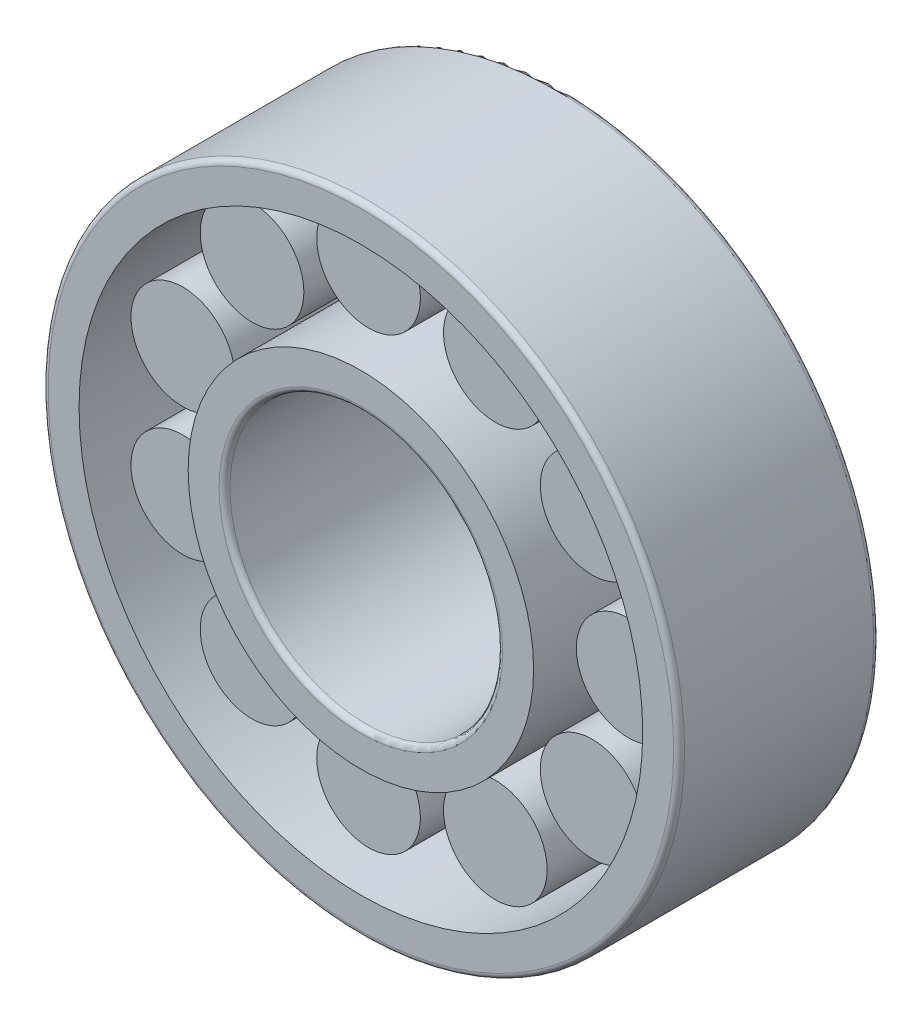
ISO-10303-21;
HEADER;
FILE_DESCRIPTION(('STEP AP214'),'2;1');
FILE_NAME('part.step','',(''),(''),'','','');
FILE_SCHEMA(('AUTOMOTIVE_DESIGN { 1 0 10303 214 1 1 1 1 }'));
ENDSEC;
DATA;
#1=APPLICATION_CONTEXT('core data for automotive mechanical design processes');
#2=APPLICATION_PROTOCOL_DEFINITION('international standard','automotive_design',2000,#1);
#3=PRODUCT_CONTEXT('',#1,'mechanical');
#4=PRODUCT('Part','Part','',(#3));
#5=PRODUCT_RELATED_PRODUCT_CATEGORY('part','',(#4));
#6=PRODUCT_DEFINITION_FORMATION('','',#4);
#7=PRODUCT_DEFINITION_CONTEXT('part definition',#1,'design');
#8=PRODUCT_DEFINITION('design','',#6,#7);
#9=PRODUCT_DEFINITION_SHAPE('','',#8);
#10=(LENGTH_UNIT() NAMED_UNIT(*) SI_UNIT(.MILLI.,.METRE.));
#11=(NAMED_UNIT(*) PLANE_ANGLE_UNIT() SI_UNIT($,.RADIAN.));
#12=(NAMED_UNIT(*) SI_UNIT($,.STERADIAN.) SOLID_ANGLE_UNIT());
#13=UNCERTAINTY_MEASURE_WITH_UNIT(LENGTH_MEASURE(1.E-05),#10,'distance_accuracy_value','');
#14=(GEOMETRIC_REPRESENTATION_CONTEXT(3) GLOBAL_UNCERTAINTY_ASSIGNED_CONTEXT((#13)) GLOBAL_UNIT_ASSIGNED_CONTEXT((#10,
#11,#12)) REPRESENTATION_CONTEXT('',''));
#15=CARTESIAN_POINT('',(0.,0.,0.));
#16=DIRECTION('',(0.,0.,1.));
#17=DIRECTION('',(1.,0.,0.));
#18=AXIS2_PLACEMENT_3D('',#15,#16,#17);
#19=CARTESIAN_POINT('',(10.5156691603898,-6.75801021819497,3.3));
#20=DIRECTION('',(0.,0.,-1.));
#21=DIRECTION('',(-0.841253532831181,0.540640817455598,0.));
#22=AXIS2_PLACEMENT_3D('',#19,#20,#21);
#23=PLANE('',#22);
#24=CARTESIAN_POINT('',(10.5156691603898,-6.75801021819497,3.3));
#25=DIRECTION('',(0.,0.,-1.));
#26=DIRECTION('',(-0.841253532831181,0.540640817455598,0.));
#27=AXIS2_PLACEMENT_3D('',#24,#25,#26);
#28=CIRCLE('',#27,2.85);
#29=CARTESIAN_POINT('',(8.1180965918209,-5.21718388844652,3.3));
#30=VERTEX_POINT('',#29);
#31=EDGE_CURVE('E11',#30,#30,#28,.T.);
#32=ORIENTED_EDGE('',*,*,#31,.F.);
#33=EDGE_LOOP('',(#32));
#34=FACE_BOUND('',#33,.T.);
#35=ADVANCED_FACE('F42',(#34),#23,.F.);
#36=CARTESIAN_POINT('',(10.5156691603898,-6.75801021819497,-3.3));
#37=DIRECTION('',(0.,0.,-1.));
#38=DIRECTION('',(-0.841253532831181,0.540640817455598,0.));
#39=AXIS2_PLACEMENT_3D('',#36,#37,#38);
#40=CYLINDRICAL_SURFACE('',#39,2.85);
#41=CARTESIAN_POINT('',(10.5156691603898,-6.75801021819497,-3.3));
#42=DIRECTION('',(0.,0.,-1.));
#43=DIRECTION('',(-0.841253532831181,0.540640817455598,0.));
#44=AXIS2_PLACEMENT_3D('',#41,#42,#43);
#45=CIRCLE('',#44,2.85);
#46=CARTESIAN_POINT('',(8.1180965918209,-5.21718388844652,-3.3));
#47=VERTEX_POINT('',#46);
#48=EDGE_CURVE('E48',#47,#47,#45,.T.);
#49=ORIENTED_EDGE('',*,*,#48,.F.);
#50=EDGE_LOOP('',(#49));
#51=FACE_BOUND('',#50,.T.);
#52=ORIENTED_EDGE('',*,*,#31,.T.);
#53=EDGE_LOOP('',(#52));
#54=FACE_BOUND('',#53,.T.);
#55=ADVANCED_FACE('F56',(#51,#54),#40,.T.);
#56=CARTESIAN_POINT('',(12.9132417289586,-8.29883654794342,-3.3));
#57=DIRECTION('',(0.,0.,1.));
#58=DIRECTION('',(0.841253532831181,-0.540640817455598,0.));
#59=AXIS2_PLACEMENT_3D('',#56,#57,#58);
#60=PLANE('',#59);
#61=ORIENTED_EDGE('',*,*,#48,.T.);
#62=EDGE_LOOP('',(#61));
#63=FACE_BOUND('',#62,.T.);
#64=ADVANCED_FACE('F54',(#63),#60,.F.);
#65=CLOSED_SHELL('',(#35,#55,#64));
#66=MANIFOLD_SOLID_BREP('B2',#65);
#67=CARTESIAN_POINT('',(5.19268766252358,-11.3703999419315,3.3));
#68=DIRECTION('',(0.,0.,-1.));
#69=DIRECTION('',(-0.415415013001886,0.909631995354519,0.));
#70=AXIS2_PLACEMENT_3D('',#67,#68,#69);
#71=PLANE('',#70);
#72=CARTESIAN_POINT('',(5.19268766252358,-11.3703999419315,3.3));
#73=DIRECTION('',(0.,0.,-1.));
#74=DIRECTION('',(-0.415415013001886,0.909631995354519,0.));
#75=AXIS2_PLACEMENT_3D('',#72,#73,#74);
#76=CIRCLE('',#75,2.85);
#77=CARTESIAN_POINT('',(4.0087548754682,-8.7779487551711,3.3));
#78=VERTEX_POINT('',#77);
#79=EDGE_CURVE('E41',#78,#78,#76,.T.);
#80=ORIENTED_EDGE('',*,*,#79,.F.);
#81=EDGE_LOOP('',(#80));
#82=FACE_BOUND('',#81,.T.);
#83=ADVANCED_FACE('F91',(#82),#71,.F.);
#84=CARTESIAN_POINT('',(5.19268766252358,-11.3703999419315,-3.3));
#85=DIRECTION('',(0.,0.,-1.));
#86=DIRECTION('',(-0.415415013001886,0.909631995354519,0.));
#87=AXIS2_PLACEMENT_3D('',#84,#85,#86);
#88=CYLINDRICAL_SURFACE('',#87,2.85);
#89=CARTESIAN_POINT('',(5.19268766252358,-11.3703999419315,-3.3));
#90=DIRECTION('',(0.,0.,-1.));
#91=DIRECTION('',(-0.415415013001886,0.909631995354519,0.));
#92=AXIS2_PLACEMENT_3D('',#89,#90,#91);
#93=CIRCLE('',#92,2.85);
#94=CARTESIAN_POINT('',(4.0087548754682,-8.7779487551711,-3.3));
#95=VERTEX_POINT('',#94);
#96=EDGE_CURVE('E97',#95,#95,#93,.T.);
#97=ORIENTED_EDGE('',*,*,#96,.F.);
#98=EDGE_LOOP('',(#97));
#99=FACE_BOUND('',#98,.T.);
#100=ORIENTED_EDGE('',*,*,#79,.T.);
#101=EDGE_LOOP('',(#100));
#102=FACE_BOUND('',#101,.T.);
#103=ADVANCED_FACE('F105',(#99,#102),#88,.T.);
#104=CARTESIAN_POINT('',(6.37662044957895,-13.9628511286919,-3.3));
#105=DIRECTION('',(0.,0.,1.));
#106=DIRECTION('',(0.415415013001886,-0.909631995354519,0.));
#107=AXIS2_PLACEMENT_3D('',#104,#105,#106);
#108=PLANE('',#107);
#109=ORIENTED_EDGE('',*,*,#96,.T.);
#110=EDGE_LOOP('',(#109));
#111=FACE_BOUND('',#110,.T.);
#112=ADVANCED_FACE('F103',(#111),#108,.F.);
#113=CLOSED_SHELL('',(#83,#103,#112));
#114=MANIFOLD_SOLID_BREP('B6',#113);
#115=CARTESIAN_POINT('',(-1.77893547841607,-12.3727680235117,3.3));
#116=DIRECTION('',(0.,0.,-1.));
#117=DIRECTION('',(0.142314838273285,0.989821441880933,0.));
#118=AXIS2_PLACEMENT_3D('',#115,#116,#117);
#119=PLANE('',#118);
#120=CARTESIAN_POINT('',(-1.77893547841607,-12.3727680235117,3.3));
#121=DIRECTION('',(0.,0.,-1.));
#122=DIRECTION('',(0.142314838273285,0.989821441880933,0.));
#123=AXIS2_PLACEMENT_3D('',#120,#121,#122);
#124=CIRCLE('',#123,2.85);
#125=CARTESIAN_POINT('',(-1.3733381893372,-9.551776914151,3.3));
#126=VERTEX_POINT('',#125);
#127=EDGE_CURVE('E90',#126,#126,#124,.T.);
#128=ORIENTED_EDGE('',*,*,#127,.F.);
#129=EDGE_LOOP('',(#128));
#130=FACE_BOUND('',#129,.T.);
#131=ADVANCED_FACE('F140',(#130),#119,.F.);
#132=CARTESIAN_POINT('',(-1.77893547841607,-12.3727680235117,-3.3));
#133=DIRECTION('',(0.,0.,-1.));
#134=DIRECTION('',(0.142314838273285,0.989821441880933,0.));
#135=AXIS2_PLACEMENT_3D('',#132,#133,#134);
#136=CYLINDRICAL_SURFACE('',#135,2.85);
#137=CARTESIAN_POINT('',(-1.77893547841607,-12.3727680235117,-3.3));
#138=DIRECTION('',(0.,0.,-1.));
#139=DIRECTION('',(0.142314838273285,0.989821441880933,0.));
#140=AXIS2_PLACEMENT_3D('',#137,#138,#139);
#141=CIRCLE('',#140,2.85);
#142=CARTESIAN_POINT('',(-1.3733381893372,-9.551776914151,-3.3));
#143=VERTEX_POINT('',#142);
#144=EDGE_CURVE('E146',#143,#143,#141,.T.);
#145=ORIENTED_EDGE('',*,*,#144,.F.);
#146=EDGE_LOOP('',(#145));
#147=FACE_BOUND('',#146,.T.);
#148=ORIENTED_EDGE('',*,*,#127,.T.);
#149=EDGE_LOOP('',(#148));
#150=FACE_BOUND('',#149,.T.);
#151=ADVANCED_FACE('F154',(#147,#150),#136,.T.);
#152=CARTESIAN_POINT('',(-2.18453276749493,-15.1937591328723,-3.3));
#153=DIRECTION('',(0.,0.,1.));
#154=DIRECTION('',(-0.142314838273285,-0.989821441880933,0.));
#155=AXIS2_PLACEMENT_3D('',#152,#153,#154);
#156=PLANE('',#155);
#157=ORIENTED_EDGE('',*,*,#144,.T.);
#158=EDGE_LOOP('',(#157));
#159=FACE_BOUND('',#158,.T.);
#160=ADVANCED_FACE('F152',(#159),#156,.F.);
#161=CLOSED_SHELL('',(#131,#151,#160));
#162=MANIFOLD_SOLID_BREP('B36',#161);
#163=CARTESIAN_POINT('',(-8.18575917431607,-9.44686967942823,3.3));
#164=DIRECTION('',(0.,0.,-1.));
#165=DIRECTION('',(0.654860733945285,0.755749574354258,0.));
#166=AXIS2_PLACEMENT_3D('',#163,#164,#165);
#167=PLANE('',#166);
#168=CARTESIAN_POINT('',(-8.18575917431607,-9.44686967942823,3.3));
#169=DIRECTION('',(0.,0.,-1.));
#170=DIRECTION('',(0.654860733945285,0.755749574354258,0.));
#171=AXIS2_PLACEMENT_3D('',#168,#169,#170);
#172=CIRCLE('',#171,2.85);
#173=CARTESIAN_POINT('',(-6.319406082572,-7.29298339251859,3.3));
#174=VERTEX_POINT('',#173);
#175=EDGE_CURVE('E139',#174,#174,#172,.T.);
#176=ORIENTED_EDGE('',*,*,#175,.F.);
#177=EDGE_LOOP('',(#176));
#178=FACE_BOUND('',#177,.T.);
#179=ADVANCED_FACE('F189',(#178),#167,.F.);
#180=CARTESIAN_POINT('',(-8.18575917431607,-9.44686967942823,-3.3));
#181=DIRECTION('',(0.,0.,-1.));
#182=DIRECTION('',(0.654860733945285,0.755749574354258,0.));
#183=AXIS2_PLACEMENT_3D('',#180,#181,#182);
#184=CYLINDRICAL_SURFACE('',#183,2.85);
#185=CARTESIAN_POINT('',(-8.18575917431607,-9.44686967942823,-3.3));
#186=DIRECTION('',(0.,0.,-1.));
#187=DIRECTION('',(0.654860733945285,0.755749574354258,0.));
#188=AXIS2_PLACEMENT_3D('',#185,#186,#187);
#189=CIRCLE('',#188,2.85);
#190=CARTESIAN_POINT('',(-6.319406082572,-7.29298339251859,-3.3));
#191=VERTEX_POINT('',#190);
#192=EDGE_CURVE('E195',#191,#191,#189,.T.);
#193=ORIENTED_EDGE('',*,*,#192,.F.);
#194=EDGE_LOOP('',(#193));
#195=FACE_BOUND('',#194,.T.);
#196=ORIENTED_EDGE('',*,*,#175,.T.);
#197=EDGE_LOOP('',(#196));
#198=FACE_BOUND('',#197,.T.);
#199=ADVANCED_FACE('F203',(#195,#198),#184,.T.);
#200=CARTESIAN_POINT('',(-10.0521122660601,-11.6007559663379,-3.3));
#201=DIRECTION('',(0.,0.,1.));
#202=DIRECTION('',(-0.654860733945285,-0.755749574354258,0.));
#203=AXIS2_PLACEMENT_3D('',#200,#201,#202);
#204=PLANE('',#203);
#205=ORIENTED_EDGE('',*,*,#192,.T.);
#206=EDGE_LOOP('',(#205));
#207=FACE_BOUND('',#206,.T.);
#208=ADVANCED_FACE('F201',(#207),#204,.F.);
#209=CLOSED_SHELL('',(#179,#199,#208));
#210=MANIFOLD_SOLID_BREP('B85',#209);
#211=CARTESIAN_POINT('',(-11.9936621701812,-3.52165696051787,3.3));
#212=DIRECTION('',(0.,0.,-1.));
#213=DIRECTION('',(0.959492973614497,0.281732556841429,0.));
#214=AXIS2_PLACEMENT_3D('',#211,#212,#213);
#215=PLANE('',#214);
#216=CARTESIAN_POINT('',(-11.9936621701812,-3.52165696051787,3.3));
#217=DIRECTION('',(0.,0.,-1.));
#218=DIRECTION('',(0.959492973614497,0.281732556841429,0.));
#219=AXIS2_PLACEMENT_3D('',#216,#217,#218);
#220=CIRCLE('',#219,2.85);
#221=CARTESIAN_POINT('',(-9.2591071953799,-2.71871917351979,3.3));
#222=VERTEX_POINT('',#221);
#223=EDGE_CURVE('E188',#222,#222,#220,.T.);
#224=ORIENTED_EDGE('',*,*,#223,.F.);
#225=EDGE_LOOP('',(#224));
#226=FACE_BOUND('',#225,.T.);
#227=ADVANCED_FACE('F238',(#226),#215,.F.);
#228=CARTESIAN_POINT('',(-11.9936621701812,-3.52165696051787,-3.3));
#229=DIRECTION('',(0.,0.,-1.));
#230=DIRECTION('',(0.959492973614497,0.281732556841429,0.));
#231=AXIS2_PLACEMENT_3D('',#228,#229,#230);
#232=CYLINDRICAL_SURFACE('',#231,2.85);
#233=CARTESIAN_POINT('',(-11.9936621701812,-3.52165696051787,-3.3));
#234=DIRECTION('',(0.,0.,-1.));
#235=DIRECTION('',(0.959492973614497,0.281732556841429,0.));
#236=AXIS2_PLACEMENT_3D('',#233,#234,#235);
#237=CIRCLE('',#236,2.85);
#238=CARTESIAN_POINT('',(-9.2591071953799,-2.71871917351979,-3.3));
#239=VERTEX_POINT('',#238);
#240=EDGE_CURVE('E244',#239,#239,#237,.T.);
#241=ORIENTED_EDGE('',*,*,#240,.F.);
#242=EDGE_LOOP('',(#241));
#243=FACE_BOUND('',#242,.T.);
#244=ORIENTED_EDGE('',*,*,#223,.T.);
#245=EDGE_LOOP('',(#244));
#246=FACE_BOUND('',#245,.T.);
#247=ADVANCED_FACE('F252',(#243,#246),#232,.T.);
#248=CARTESIAN_POINT('',(-14.7282171449825,-4.32459474751594,-3.3));
#249=DIRECTION('',(0.,0.,1.));
#250=DIRECTION('',(-0.959492973614497,-0.281732556841429,0.));
#251=AXIS2_PLACEMENT_3D('',#248,#249,#250);
#252=PLANE('',#251);
#253=ORIENTED_EDGE('',*,*,#240,.T.);
#254=EDGE_LOOP('',(#253));
#255=FACE_BOUND('',#254,.T.);
#256=ADVANCED_FACE('F250',(#255),#252,.F.);
#257=CLOSED_SHELL('',(#227,#247,#256));
#258=MANIFOLD_SOLID_BREP('B134',#257);
#259=CARTESIAN_POINT('',(-11.9936621701812,3.52165696051787,3.3));
#260=DIRECTION('',(0.,0.,-1.));
#261=DIRECTION('',(0.959492973614498,-0.28173255684143,0.));
#262=AXIS2_PLACEMENT_3D('',#259,#260,#261);
#263=PLANE('',#262);
#264=CARTESIAN_POINT('',(-11.9936621701812,3.52165696051787,3.3));
#265=DIRECTION('',(0.,0.,-1.));
#266=DIRECTION('',(0.959492973614498,-0.28173255684143,0.));
#267=AXIS2_PLACEMENT_3D('',#264,#265,#266);
#268=CIRCLE('',#267,2.85);
#269=CARTESIAN_POINT('',(-9.2591071953799,2.7187191735198,3.3));
#270=VERTEX_POINT('',#269);
#271=EDGE_CURVE('E237',#270,#270,#268,.T.);
#272=ORIENTED_EDGE('',*,*,#271,.F.);
#273=EDGE_LOOP('',(#272));
#274=FACE_BOUND('',#273,.T.);
#275=ADVANCED_FACE('F287',(#274),#263,.F.);
#276=CARTESIAN_POINT('',(-11.9936621701812,3.52165696051787,-3.3));
#277=DIRECTION('',(0.,0.,-1.));
#278=DIRECTION('',(0.959492973614498,-0.28173255684143,0.));
#279=AXIS2_PLACEMENT_3D('',#276,#277,#278);
#280=CYLINDRICAL_SURFACE('',#279,2.85);
#281=CARTESIAN_POINT('',(-11.9936621701812,3.52165696051787,-3.3));
#282=DIRECTION('',(0.,0.,-1.));
#283=DIRECTION('',(0.959492973614498,-0.28173255684143,0.));
#284=AXIS2_PLACEMENT_3D('',#281,#282,#283);
#285=CIRCLE('',#284,2.85);
#286=CARTESIAN_POINT('',(-9.2591071953799,2.7187191735198,-3.3));
#287=VERTEX_POINT('',#286);
#288=EDGE_CURVE('E293',#287,#287,#285,.T.);
#289=ORIENTED_EDGE('',*,*,#288,.F.);
#290=EDGE_LOOP('',(#289));
#291=FACE_BOUND('',#290,.T.);
#292=ORIENTED_EDGE('',*,*,#271,.T.);
#293=EDGE_LOOP('',(#292));
#294=FACE_BOUND('',#293,.T.);
#295=ADVANCED_FACE('F301',(#291,#294),#280,.T.);
#296=CARTESIAN_POINT('',(-14.7282171449825,4.32459474751595,-3.3));
#297=DIRECTION('',(0.,0.,1.));
#298=DIRECTION('',(-0.959492973614498,0.28173255684143,0.));
#299=AXIS2_PLACEMENT_3D('',#296,#297,#298);
#300=PLANE('',#299);
#301=ORIENTED_EDGE('',*,*,#288,.T.);
#302=EDGE_LOOP('',(#301));
#303=FACE_BOUND('',#302,.T.);
#304=ADVANCED_FACE('F299',(#303),#300,.F.);
#305=CLOSED_SHELL('',(#275,#295,#304));
#306=MANIFOLD_SOLID_BREP('B183',#305);
#307=CARTESIAN_POINT('',(-8.18575917431606,9.44686967942823,3.3));
#308=DIRECTION('',(0.,0.,-1.));
#309=DIRECTION('',(0.654860733945285,-0.755749574354258,0.));
#310=AXIS2_PLACEMENT_3D('',#307,#308,#309);
#311=PLANE('',#310);
#312=CARTESIAN_POINT('',(-8.18575917431606,9.44686967942823,3.3));
#313=DIRECTION('',(0.,0.,-1.));
#314=DIRECTION('',(0.654860733945285,-0.755749574354258,0.));
#315=AXIS2_PLACEMENT_3D('',#312,#313,#314);
#316=CIRCLE('',#315,2.85);
#317=CARTESIAN_POINT('',(-6.319406082572,7.29298339251859,3.3));
#318=VERTEX_POINT('',#317);
#319=EDGE_CURVE('E286',#318,#318,#316,.T.);
#320=ORIENTED_EDGE('',*,*,#319,.F.);
#321=EDGE_LOOP('',(#320));
#322=FACE_BOUND('',#321,.T.);
#323=ADVANCED_FACE('F336',(#322),#311,.F.);
#324=CARTESIAN_POINT('',(-8.18575917431606,9.44686967942823,-3.3));
#325=DIRECTION('',(0.,0.,-1.));
#326=DIRECTION('',(0.654860733945285,-0.755749574354258,0.));
#327=AXIS2_PLACEMENT_3D('',#324,#325,#326);
#328=CYLINDRICAL_SURFACE('',#327,2.85);
#329=CARTESIAN_POINT('',(-8.18575917431606,9.44686967942823,-3.3));
#330=DIRECTION('',(0.,0.,-1.));
#331=DIRECTION('',(0.654860733945285,-0.755749574354258,0.));
#332=AXIS2_PLACEMENT_3D('',#329,#330,#331);
#333=CIRCLE('',#332,2.85);
#334=CARTESIAN_POINT('',(-6.319406082572,7.29298339251859,-3.3));
#335=VERTEX_POINT('',#334);
#336=EDGE_CURVE('E342',#335,#335,#333,.T.);
#337=ORIENTED_EDGE('',*,*,#336,.F.);
#338=EDGE_LOOP('',(#337));
#339=FACE_BOUND('',#338,.T.);
#340=ORIENTED_EDGE('',*,*,#319,.T.);
#341=EDGE_LOOP('',(#340));
#342=FACE_BOUND('',#341,.T.);
#343=ADVANCED_FACE('F350',(#339,#342),#328,.T.);
#344=CARTESIAN_POINT('',(-10.0521122660601,11.6007559663379,-3.3));
#345=DIRECTION('',(0.,0.,1.));
#346=DIRECTION('',(-0.654860733945285,0.755749574354258,0.));
#347=AXIS2_PLACEMENT_3D('',#344,#345,#346);
#348=PLANE('',#347);
#349=ORIENTED_EDGE('',*,*,#336,.T.);
#350=EDGE_LOOP('',(#349));
#351=FACE_BOUND('',#350,.T.);
#352=ADVANCED_FACE('F348',(#351),#348,.F.);
#353=CLOSED_SHELL('',(#323,#343,#352));
#354=MANIFOLD_SOLID_BREP('B232',#353);
#355=CARTESIAN_POINT('',(-1.77893547841606,12.3727680235117,3.3));
#356=DIRECTION('',(0.,0.,-1.));
#357=DIRECTION('',(0.142314838273285,-0.989821441880933,0.));
#358=AXIS2_PLACEMENT_3D('',#355,#356,#357);
#359=PLANE('',#358);
#360=CARTESIAN_POINT('',(-1.77893547841606,12.3727680235117,3.3));
#361=DIRECTION('',(0.,0.,-1.));
#362=DIRECTION('',(0.142314838273285,-0.989821441880933,0.));
#363=AXIS2_PLACEMENT_3D('',#360,#361,#362);
#364=CIRCLE('',#363,2.85);
#365=CARTESIAN_POINT('',(-1.3733381893372,9.551776914151,3.3));
#366=VERTEX_POINT('',#365);
#367=EDGE_CURVE('E335',#366,#366,#364,.T.);
#368=ORIENTED_EDGE('',*,*,#367,.F.);
#369=EDGE_LOOP('',(#368));
#370=FACE_BOUND('',#369,.T.);
#371=ADVANCED_FACE('F385',(#370),#359,.F.);
#372=CARTESIAN_POINT('',(-1.77893547841606,12.3727680235117,-3.3));
#373=DIRECTION('',(0.,0.,-1.));
#374=DIRECTION('',(0.142314838273285,-0.989821441880933,0.));
#375=AXIS2_PLACEMENT_3D('',#372,#373,#374);
#376=CYLINDRICAL_SURFACE('',#375,2.85);
#377=CARTESIAN_POINT('',(-1.77893547841606,12.3727680235117,-3.3));
#378=DIRECTION('',(0.,0.,-1.));
#379=DIRECTION('',(0.142314838273285,-0.989821441880933,0.));
#380=AXIS2_PLACEMENT_3D('',#377,#378,#379);
#381=CIRCLE('',#380,2.85);
#382=CARTESIAN_POINT('',(-1.3733381893372,9.551776914151,-3.3));
#383=VERTEX_POINT('',#382);
#384=EDGE_CURVE('E391',#383,#383,#381,.T.);
#385=ORIENTED_EDGE('',*,*,#384,.F.);
#386=EDGE_LOOP('',(#385));
#387=FACE_BOUND('',#386,.T.);
#388=ORIENTED_EDGE('',*,*,#367,.T.);
#389=EDGE_LOOP('',(#388));
#390=FACE_BOUND('',#389,.T.);
#391=ADVANCED_FACE('F399',(#387,#390),#376,.T.);
#392=CARTESIAN_POINT('',(-2.18453276749493,15.1937591328723,-3.3));
#393=DIRECTION('',(0.,0.,1.));
#394=DIRECTION('',(-0.142314838273285,0.989821441880933,0.));
#395=AXIS2_PLACEMENT_3D('',#392,#393,#394);
#396=PLANE('',#395);
#397=ORIENTED_EDGE('',*,*,#384,.T.);
#398=EDGE_LOOP('',(#397));
#399=FACE_BOUND('',#398,.T.);
#400=ADVANCED_FACE('F397',(#399),#396,.F.);
#401=CLOSED_SHELL('',(#371,#391,#400));
#402=MANIFOLD_SOLID_BREP('B281',#401);
#403=CARTESIAN_POINT('',(5.19268766252358,11.3703999419315,3.3));
#404=DIRECTION('',(0.,0.,-1.));
#405=DIRECTION('',(-0.415415013001886,-0.909631995354518,0.));
#406=AXIS2_PLACEMENT_3D('',#403,#404,#405);
#407=PLANE('',#406);
#408=CARTESIAN_POINT('',(5.19268766252358,11.3703999419315,3.3));
#409=DIRECTION('',(0.,0.,-1.));
#410=DIRECTION('',(-0.415415013001886,-0.909631995354518,0.));
#411=AXIS2_PLACEMENT_3D('',#408,#409,#410);
#412=CIRCLE('',#411,2.85);
#413=CARTESIAN_POINT('',(4.0087548754682,8.7779487551711,3.3));
#414=VERTEX_POINT('',#413);
#415=EDGE_CURVE('E384',#414,#414,#412,.T.);
#416=ORIENTED_EDGE('',*,*,#415,.F.);
#417=EDGE_LOOP('',(#416));
#418=FACE_BOUND('',#417,.T.);
#419=ADVANCED_FACE('F434',(#418),#407,.F.);
#420=CARTESIAN_POINT('',(5.19268766252358,11.3703999419315,-3.3));
#421=DIRECTION('',(0.,0.,-1.));
#422=DIRECTION('',(-0.415415013001886,-0.909631995354518,0.));
#423=AXIS2_PLACEMENT_3D('',#420,#421,#422);
#424=CYLINDRICAL_SURFACE('',#423,2.85);
#425=CARTESIAN_POINT('',(5.19268766252358,11.3703999419315,-3.3));
#426=DIRECTION('',(0.,0.,-1.));
#427=DIRECTION('',(-0.415415013001886,-0.909631995354518,0.));
#428=AXIS2_PLACEMENT_3D('',#425,#426,#427);
#429=CIRCLE('',#428,2.85);
#430=CARTESIAN_POINT('',(4.0087548754682,8.7779487551711,-3.3));
#431=VERTEX_POINT('',#430);
#432=EDGE_CURVE('E440',#431,#431,#429,.T.);
#433=ORIENTED_EDGE('',*,*,#432,.F.);
#434=EDGE_LOOP('',(#433));
#435=FACE_BOUND('',#434,.T.);
#436=ORIENTED_EDGE('',*,*,#415,.T.);
#437=EDGE_LOOP('',(#436));
#438=FACE_BOUND('',#437,.T.);
#439=ADVANCED_FACE('F448',(#435,#438),#424,.T.);
#440=CARTESIAN_POINT('',(6.37662044957896,13.9628511286919,-3.3));
#441=DIRECTION('',(0.,0.,1.));
#442=DIRECTION('',(0.415415013001886,0.909631995354518,0.));
#443=AXIS2_PLACEMENT_3D('',#440,#441,#442);
#444=PLANE('',#443);
#445=ORIENTED_EDGE('',*,*,#432,.T.);
#446=EDGE_LOOP('',(#445));
#447=FACE_BOUND('',#446,.T.);
#448=ADVANCED_FACE('F446',(#447),#444,.F.);
#449=CLOSED_SHELL('',(#419,#439,#448));
#450=MANIFOLD_SOLID_BREP('B330',#449);
#451=CARTESIAN_POINT('',(10.5156691603898,6.75801021819497,3.3));
#452=DIRECTION('',(0.,0.,-1.));
#453=DIRECTION('',(-0.841253532831181,-0.540640817455598,0.));
#454=AXIS2_PLACEMENT_3D('',#451,#452,#453);
#455=PLANE('',#454);
#456=CARTESIAN_POINT('',(10.5156691603898,6.75801021819497,3.3));
#457=DIRECTION('',(0.,0.,-1.));
#458=DIRECTION('',(-0.841253532831181,-0.540640817455598,0.));
#459=AXIS2_PLACEMENT_3D('',#456,#457,#458);
#460=CIRCLE('',#459,2.85);
#461=CARTESIAN_POINT('',(8.1180965918209,5.21718388844652,3.3));
#462=VERTEX_POINT('',#461);
#463=EDGE_CURVE('E433',#462,#462,#460,.T.);
#464=ORIENTED_EDGE('',*,*,#463,.F.);
#465=EDGE_LOOP('',(#464));
#466=FACE_BOUND('',#465,.T.);
#467=ADVANCED_FACE('F483',(#466),#455,.F.);
#468=CARTESIAN_POINT('',(10.5156691603898,6.75801021819497,-3.3));
#469=DIRECTION('',(0.,0.,-1.));
#470=DIRECTION('',(-0.841253532831181,-0.540640817455598,0.));
#471=AXIS2_PLACEMENT_3D('',#468,#469,#470);
#472=CYLINDRICAL_SURFACE('',#471,2.85);
#473=CARTESIAN_POINT('',(10.5156691603898,6.75801021819497,-3.3));
#474=DIRECTION('',(0.,0.,-1.));
#475=DIRECTION('',(-0.841253532831181,-0.540640817455598,0.));
#476=AXIS2_PLACEMENT_3D('',#473,#474,#475);
#477=CIRCLE('',#476,2.85);
#478=CARTESIAN_POINT('',(8.1180965918209,5.21718388844652,-3.3));
#479=VERTEX_POINT('',#478);
#480=EDGE_CURVE('E489',#479,#479,#477,.T.);
#481=ORIENTED_EDGE('',*,*,#480,.F.);
#482=EDGE_LOOP('',(#481));
#483=FACE_BOUND('',#482,.T.);
#484=ORIENTED_EDGE('',*,*,#463,.T.);
#485=EDGE_LOOP('',(#484));
#486=FACE_BOUND('',#485,.T.);
#487=ADVANCED_FACE('F497',(#483,#486),#472,.T.);
#488=CARTESIAN_POINT('',(12.9132417289586,8.29883654794342,-3.3));
#489=DIRECTION('',(0.,0.,1.));
#490=DIRECTION('',(0.841253532831181,0.540640817455598,0.));
#491=AXIS2_PLACEMENT_3D('',#488,#489,#490);
#492=PLANE('',#491);
#493=ORIENTED_EDGE('',*,*,#480,.T.);
#494=EDGE_LOOP('',(#493));
#495=FACE_BOUND('',#494,.T.);
#496=ADVANCED_FACE('F495',(#495),#492,.F.);
#497=CLOSED_SHELL('',(#467,#487,#496));
#498=MANIFOLD_SOLID_BREP('B379',#497);
#499=CARTESIAN_POINT('',(12.5,0.,3.3));
#500=DIRECTION('',(0.,0.,-1.));
#501=DIRECTION('',(-1.,0.,0.));
#502=AXIS2_PLACEMENT_3D('',#499,#500,#501);
#503=PLANE('',#502);
#504=CARTESIAN_POINT('',(12.5,0.,3.3));
#505=DIRECTION('',(0.,0.,-1.));
#506=DIRECTION('',(-1.,0.,0.));
#507=AXIS2_PLACEMENT_3D('',#504,#505,#506);
#508=CIRCLE('',#507,2.85);
#509=CARTESIAN_POINT('',(9.65,0.,3.3));
#510=VERTEX_POINT('',#509);
#511=EDGE_CURVE('E482',#510,#510,#508,.T.);
#512=ORIENTED_EDGE('',*,*,#511,.F.);
#513=EDGE_LOOP('',(#512));
#514=FACE_BOUND('',#513,.T.);
#515=ADVANCED_FACE('F532',(#514),#503,.F.);
#516=CARTESIAN_POINT('',(12.5,0.,-3.3));
#517=DIRECTION('',(0.,0.,-1.));
#518=DIRECTION('',(-1.,0.,0.));
#519=AXIS2_PLACEMENT_3D('',#516,#517,#518);
#520=CYLINDRICAL_SURFACE('',#519,2.85);
#521=CARTESIAN_POINT('',(12.5,0.,-3.3));
#522=DIRECTION('',(0.,0.,-1.));
#523=DIRECTION('',(-1.,0.,0.));
#524=AXIS2_PLACEMENT_3D('',#521,#522,#523);
#525=CIRCLE('',#524,2.85);
#526=CARTESIAN_POINT('',(9.65,0.,-3.3));
#527=VERTEX_POINT('',#526);
#528=EDGE_CURVE('E538',#527,#527,#525,.T.);
#529=ORIENTED_EDGE('',*,*,#528,.F.);
#530=EDGE_LOOP('',(#529));
#531=FACE_BOUND('',#530,.T.);
#532=ORIENTED_EDGE('',*,*,#511,.T.);
#533=EDGE_LOOP('',(#532));
#534=FACE_BOUND('',#533,.T.);
#535=ADVANCED_FACE('F546',(#531,#534),#520,.T.);
#536=CARTESIAN_POINT('',(15.35,0.,-3.3));
#537=DIRECTION('',(0.,0.,1.));
#538=DIRECTION('',(1.,0.,0.));
#539=AXIS2_PLACEMENT_3D('',#536,#537,#538);
#540=PLANE('',#539);
#541=ORIENTED_EDGE('',*,*,#528,.T.);
#542=EDGE_LOOP('',(#541));
#543=FACE_BOUND('',#542,.T.);
#544=ADVANCED_FACE('F544',(#543),#540,.F.);
#545=CLOSED_SHELL('',(#515,#535,#544));
#546=MANIFOLD_SOLID_BREP('B428',#545);
#547=CARTESIAN_POINT('',(0.,0.,9.25));
#548=DIRECTION('',(0.,0.,1.));
#549=DIRECTION('',(1.,0.,0.));
#550=AXIS2_PLACEMENT_3D('',#547,#548,#549);
#551=CYLINDRICAL_SURFACE('',#550,15.5);
#552=CARTESIAN_POINT('',(0.,0.,5.5));
#553=DIRECTION('',(0.,0.,1.));
#554=DIRECTION('',(1.,0.,0.));
#555=AXIS2_PLACEMENT_3D('',#552,#553,#554);
#556=CIRCLE('',#555,15.5);
#557=CARTESIAN_POINT('',(15.5,0.,5.5));
#558=VERTEX_POINT('',#557);
#559=EDGE_CURVE('E600',#558,#558,#556,.T.);
#560=ORIENTED_EDGE('',*,*,#559,.T.);
#561=EDGE_LOOP('',(#560));
#562=FACE_BOUND('',#561,.T.);
#563=CARTESIAN_POINT('',(0.,0.,-5.5));
#564=DIRECTION('',(0.,0.,1.));
#565=DIRECTION('',(1.,0.,0.));
#566=AXIS2_PLACEMENT_3D('',#563,#564,#565);
#567=CIRCLE('',#566,15.5);
#568=CARTESIAN_POINT('',(15.5,0.,-5.5));
#569=VERTEX_POINT('',#568);
#570=EDGE_CURVE('E603',#569,#569,#567,.T.);
#571=ORIENTED_EDGE('',*,*,#570,.F.);
#572=EDGE_LOOP('',(#571));
#573=FACE_BOUND('',#572,.T.);
#574=ADVANCED_FACE('F580',(#562,#573),#551,.F.);
#575=CARTESIAN_POINT('',(15.5,0.,5.5));
#576=DIRECTION('',(0.,0.,1.));
#577=DIRECTION('',(1.,0.,0.));
#578=AXIS2_PLACEMENT_3D('',#575,#576,#577);
#579=PLANE('',#578);
#580=CARTESIAN_POINT('',(0.,0.,5.5));
#581=DIRECTION('',(0.,0.,1.));
#582=DIRECTION('',(1.,0.,0.));
#583=AXIS2_PLACEMENT_3D('',#580,#581,#582);
#584=CIRCLE('',#583,17.2);
#585=CARTESIAN_POINT('',(17.2,0.,5.5));
#586=VERTEX_POINT('',#585);
#587=EDGE_CURVE('E531',#586,#586,#584,.T.);
#588=ORIENTED_EDGE('',*,*,#587,.T.);
#589=EDGE_LOOP('',(#588));
#590=FACE_BOUND('',#589,.T.);
#591=ORIENTED_EDGE('',*,*,#559,.F.);
#592=EDGE_LOOP('',(#591));
#593=FACE_BOUND('',#592,.T.);
#594=ADVANCED_FACE('F610',(#590,#593),#579,.T.);
#595=CARTESIAN_POINT('',(0.,0.,9.25));
#596=DIRECTION('',(0.,0.,1.));
#597=DIRECTION('',(1.,0.,0.));
#598=AXIS2_PLACEMENT_3D('',#595,#596,#597);
#599=CYLINDRICAL_SURFACE('',#598,17.5);
#600=CARTESIAN_POINT('',(0.,0.,-5.2));
#601=DIRECTION('',(0.,0.,-1.));
#602=DIRECTION('',(-1.,0.,0.));
#603=AXIS2_PLACEMENT_3D('',#600,#601,#602);
#604=CIRCLE('',#603,17.5);
#605=CARTESIAN_POINT('',(-17.5,0.,-5.2));
#606=VERTEX_POINT('',#605);
#607=EDGE_CURVE('E591',#606,#606,#604,.F.);
#608=ORIENTED_EDGE('',*,*,#607,.T.);
#609=EDGE_LOOP('',(#608));
#610=FACE_BOUND('',#609,.T.);
#611=CARTESIAN_POINT('',(0.,0.,5.2));
#612=DIRECTION('',(0.,0.,1.));
#613=DIRECTION('',(1.,0.,0.));
#614=AXIS2_PLACEMENT_3D('',#611,#612,#613);
#615=CIRCLE('',#614,17.5);
#616=CARTESIAN_POINT('',(17.5,0.,5.2));
#617=VERTEX_POINT('',#616);
#618=EDGE_CURVE('E595',#617,#617,#615,.F.);
#619=ORIENTED_EDGE('',*,*,#618,.T.);
#620=EDGE_LOOP('',(#619));
#621=FACE_BOUND('',#620,.T.);
#622=ADVANCED_FACE('F616',(#610,#621),#599,.T.);
#623=CARTESIAN_POINT('',(17.5,0.,-5.5));
#624=DIRECTION('',(0.,0.,-1.));
#625=DIRECTION('',(-1.,0.,0.));
#626=AXIS2_PLACEMENT_3D('',#623,#624,#625);
#627=PLANE('',#626);
#628=CARTESIAN_POINT('',(0.,0.,-5.5));
#629=DIRECTION('',(0.,0.,-1.));
#630=DIRECTION('',(-1.,0.,0.));
#631=AXIS2_PLACEMENT_3D('',#628,#629,#630);
#632=CIRCLE('',#631,17.2);
#633=CARTESIAN_POINT('',(-17.2,0.,-5.5));
#634=VERTEX_POINT('',#633);
#635=EDGE_CURVE('E587',#634,#634,#632,.T.);
#636=ORIENTED_EDGE('',*,*,#635,.T.);
#637=EDGE_LOOP('',(#636));
#638=FACE_BOUND('',#637,.T.);
#639=ORIENTED_EDGE('',*,*,#570,.T.);
#640=EDGE_LOOP('',(#639));
#641=FACE_BOUND('',#640,.T.);
#642=ADVANCED_FACE('F607',(#638,#641),#627,.T.);
#643=CARTESIAN_POINT('',(0.,0.,-5.2));
#644=DIRECTION('',(0.,0.,-1.));
#645=DIRECTION('',(-1.,0.,0.));
#646=AXIS2_PLACEMENT_3D('',#643,#644,#645);
#647=TOROIDAL_SURFACE('',#646,17.2,0.3);
#648=ORIENTED_EDGE('',*,*,#635,.F.);
#649=EDGE_LOOP('',(#648));
#650=FACE_BOUND('',#649,.T.);
#651=ORIENTED_EDGE('',*,*,#607,.F.);
#652=EDGE_LOOP('',(#651));
#653=FACE_BOUND('',#652,.T.);
#654=ADVANCED_FACE('F619',(#650,#653),#647,.T.);
#655=CARTESIAN_POINT('',(0.,0.,5.2));
#656=DIRECTION('',(0.,0.,1.));
#657=DIRECTION('',(1.,0.,0.));
#658=AXIS2_PLACEMENT_3D('',#655,#656,#657);
#659=TOROIDAL_SURFACE('',#658,17.2,0.3);
#660=ORIENTED_EDGE('',*,*,#618,.F.);
#661=EDGE_LOOP('',(#660));
#662=FACE_BOUND('',#661,.T.);
#663=ORIENTED_EDGE('',*,*,#587,.F.);
#664=EDGE_LOOP('',(#663));
#665=FACE_BOUND('',#664,.T.);
#666=ADVANCED_FACE('F582',(#662,#665),#659,.T.);
#667=CLOSED_SHELL('',(#574,#594,#622,#642,#654,#666));
#668=MANIFOLD_SOLID_BREP('B477',#667);
#669=CARTESIAN_POINT('',(0.,0.,9.25));
#670=DIRECTION('',(0.,0.,1.));
#671=DIRECTION('',(1.,0.,0.));
#672=AXIS2_PLACEMENT_3D('',#669,#670,#671);
#673=CYLINDRICAL_SURFACE('',#672,7.5);
#674=CARTESIAN_POINT('',(0.,0.,-5.2));
#675=DIRECTION('',(0.,0.,-1.));
#676=DIRECTION('',(-1.,0.,0.));
#677=AXIS2_PLACEMENT_3D('',#674,#675,#676);
#678=CIRCLE('',#677,7.5);
#679=CARTESIAN_POINT('',(-7.5,0.,-5.2));
#680=VERTEX_POINT('',#679);
#681=EDGE_CURVE('E679',#680,#680,#678,.T.);
#682=ORIENTED_EDGE('',*,*,#681,.T.);
#683=EDGE_LOOP('',(#682));
#684=FACE_BOUND('',#683,.T.);
#685=CARTESIAN_POINT('',(0.,0.,5.2));
#686=DIRECTION('',(0.,0.,1.));
#687=DIRECTION('',(1.,0.,0.));
#688=AXIS2_PLACEMENT_3D('',#685,#686,#687);
#689=CIRCLE('',#688,7.5);
#690=CARTESIAN_POINT('',(7.5,0.,5.2));
#691=VERTEX_POINT('',#690);
#692=EDGE_CURVE('E683',#691,#691,#689,.T.);
#693=ORIENTED_EDGE('',*,*,#692,.T.);
#694=EDGE_LOOP('',(#693));
#695=FACE_BOUND('',#694,.T.);
#696=ADVANCED_FACE('F672',(#684,#695),#673,.F.);
#697=CARTESIAN_POINT('',(7.5,0.,5.5));
#698=DIRECTION('',(0.,0.,1.));
#699=DIRECTION('',(1.,0.,0.));
#700=AXIS2_PLACEMENT_3D('',#697,#698,#699);
#701=PLANE('',#700);
#702=CARTESIAN_POINT('',(0.,0.,5.5));
#703=DIRECTION('',(0.,0.,1.));
#704=DIRECTION('',(1.,0.,0.));
#705=AXIS2_PLACEMENT_3D('',#702,#703,#704);
#706=CIRCLE('',#705,7.8);
#707=CARTESIAN_POINT('',(7.8,0.,5.5));
#708=VERTEX_POINT('',#707);
#709=EDGE_CURVE('E579',#708,#708,#706,.F.);
#710=ORIENTED_EDGE('',*,*,#709,.T.);
#711=EDGE_LOOP('',(#710));
#712=FACE_BOUND('',#711,.T.);
#713=CARTESIAN_POINT('',(0.,0.,5.5));
#714=DIRECTION('',(0.,0.,1.));
#715=DIRECTION('',(1.,0.,0.));
#716=AXIS2_PLACEMENT_3D('',#713,#714,#715);
#717=CIRCLE('',#716,9.5);
#718=CARTESIAN_POINT('',(9.5,0.,5.5));
#719=VERTEX_POINT('',#718);
#720=EDGE_CURVE('E692',#719,#719,#717,.T.);
#721=ORIENTED_EDGE('',*,*,#720,.T.);
#722=EDGE_LOOP('',(#721));
#723=FACE_BOUND('',#722,.T.);
#724=ADVANCED_FACE('F712',(#712,#723),#701,.T.);
#725=CARTESIAN_POINT('',(0.,0.,9.25));
#726=DIRECTION('',(0.,0.,1.));
#727=DIRECTION('',(1.,0.,0.));
#728=AXIS2_PLACEMENT_3D('',#725,#726,#727);
#729=CYLINDRICAL_SURFACE('',#728,9.5);
#730=CARTESIAN_POINT('',(0.,0.,-5.5));
#731=DIRECTION('',(0.,0.,1.));
#732=DIRECTION('',(1.,0.,0.));
#733=AXIS2_PLACEMENT_3D('',#730,#731,#732);
#734=CIRCLE('',#733,9.5);
#735=CARTESIAN_POINT('',(9.5,0.,-5.5));
#736=VERTEX_POINT('',#735);
#737=EDGE_CURVE('E695',#736,#736,#734,.T.);
#738=ORIENTED_EDGE('',*,*,#737,.T.);
#739=EDGE_LOOP('',(#738));
#740=FACE_BOUND('',#739,.T.);
#741=ORIENTED_EDGE('',*,*,#720,.F.);
#742=EDGE_LOOP('',(#741));
#743=FACE_BOUND('',#742,.T.);
#744=ADVANCED_FACE('F699',(#740,#743),#729,.T.);
#745=CARTESIAN_POINT('',(9.5,0.,-5.5));
#746=DIRECTION('',(0.,0.,-1.));
#747=DIRECTION('',(-1.,0.,0.));
#748=AXIS2_PLACEMENT_3D('',#745,#746,#747);
#749=PLANE('',#748);
#750=CARTESIAN_POINT('',(0.,0.,-5.5));
#751=DIRECTION('',(0.,0.,-1.));
#752=DIRECTION('',(-1.,0.,0.));
#753=AXIS2_PLACEMENT_3D('',#750,#751,#752);
#754=CIRCLE('',#753,7.8);
#755=CARTESIAN_POINT('',(-7.8,0.,-5.5));
#756=VERTEX_POINT('',#755);
#757=EDGE_CURVE('E687',#756,#756,#754,.F.);
#758=ORIENTED_EDGE('',*,*,#757,.T.);
#759=EDGE_LOOP('',(#758));
#760=FACE_BOUND('',#759,.T.);
#761=ORIENTED_EDGE('',*,*,#737,.F.);
#762=EDGE_LOOP('',(#761));
#763=FACE_BOUND('',#762,.T.);
#764=ADVANCED_FACE('F702',(#760,#763),#749,.T.);
#765=CARTESIAN_POINT('',(0.,0.,-5.2));
#766=DIRECTION('',(0.,0.,-1.));
#767=DIRECTION('',(-1.,0.,0.));
#768=AXIS2_PLACEMENT_3D('',#765,#766,#767);
#769=TOROIDAL_SURFACE('',#768,7.8,0.3);
#770=ORIENTED_EDGE('',*,*,#681,.F.);
#771=EDGE_LOOP('',(#770));
#772=FACE_BOUND('',#771,.T.);
#773=ORIENTED_EDGE('',*,*,#757,.F.);
#774=EDGE_LOOP('',(#773));
#775=FACE_BOUND('',#774,.T.);
#776=ADVANCED_FACE('F704',(#772,#775),#769,.T.);
#777=CARTESIAN_POINT('',(0.,0.,5.2));
#778=DIRECTION('',(0.,0.,1.));
#779=DIRECTION('',(1.,0.,0.));
#780=AXIS2_PLACEMENT_3D('',#777,#778,#779);
#781=TOROIDAL_SURFACE('',#780,7.8,0.3);
#782=ORIENTED_EDGE('',*,*,#709,.F.);
#783=EDGE_LOOP('',(#782));
#784=FACE_BOUND('',#783,.T.);
#785=ORIENTED_EDGE('',*,*,#692,.F.);
#786=EDGE_LOOP('',(#785));
#787=FACE_BOUND('',#786,.T.);
#788=ADVANCED_FACE('F674',(#784,#787),#781,.T.);
#789=CLOSED_SHELL('',(#696,#724,#744,#764,#776,#788));
#790=MANIFOLD_SOLID_BREP('B526',#789);
#791=ADVANCED_BREP_SHAPE_REPRESENTATION('',(#18,#66,#114,#162,#210,#258,#306,#354,#402,#450,
#498,#546,#668,#790),#14);
#792=SHAPE_DEFINITION_REPRESENTATION(#9,#791);
ENDSEC;
END-ISO-10303-21;
